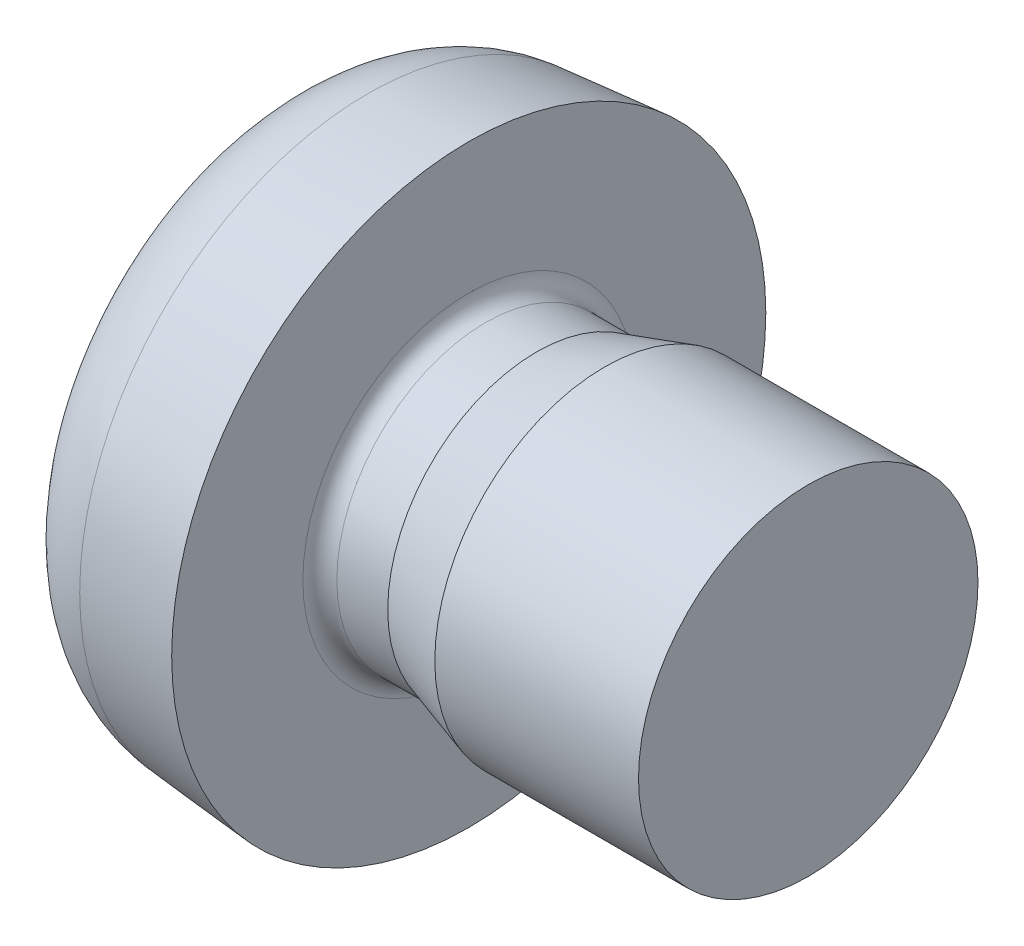
ISO-10303-21;
HEADER;
FILE_DESCRIPTION(('STEP AP214'),'2;1');
FILE_NAME('part.step','',(''),(''),'','','');
FILE_SCHEMA(('AUTOMOTIVE_DESIGN { 1 0 10303 214 1 1 1 1 }'));
ENDSEC;
DATA;
#1=APPLICATION_CONTEXT('core data for automotive mechanical design processes');
#2=APPLICATION_PROTOCOL_DEFINITION('international standard','automotive_design',2000,#1);
#3=PRODUCT_CONTEXT('',#1,'mechanical');
#4=PRODUCT('Part','Part','',(#3));
#5=PRODUCT_RELATED_PRODUCT_CATEGORY('part','',(#4));
#6=PRODUCT_DEFINITION_FORMATION('','',#4);
#7=PRODUCT_DEFINITION_CONTEXT('part definition',#1,'design');
#8=PRODUCT_DEFINITION('design','',#6,#7);
#9=PRODUCT_DEFINITION_SHAPE('','',#8);
#10=(LENGTH_UNIT() NAMED_UNIT(*) SI_UNIT(.MILLI.,.METRE.));
#11=(NAMED_UNIT(*) PLANE_ANGLE_UNIT() SI_UNIT($,.RADIAN.));
#12=(NAMED_UNIT(*) SI_UNIT($,.STERADIAN.) SOLID_ANGLE_UNIT());
#13=UNCERTAINTY_MEASURE_WITH_UNIT(LENGTH_MEASURE(1.E-05),#10,'distance_accuracy_value','');
#14=(GEOMETRIC_REPRESENTATION_CONTEXT(3) GLOBAL_UNCERTAINTY_ASSIGNED_CONTEXT((#13)) GLOBAL_UNIT_ASSIGNED_CONTEXT((#10,
#11,#12)) REPRESENTATION_CONTEXT('',''));
#15=CARTESIAN_POINT('',(0.,0.,0.));
#16=DIRECTION('',(0.,0.,1.));
#17=DIRECTION('',(1.,0.,0.));
#18=AXIS2_PLACEMENT_3D('',#15,#16,#17);
#19=CARTESIAN_POINT('',(3.19999999999697,5.00467722819309E-13,0.));
#20=DIRECTION('',(-1.,0.,0.));
#21=DIRECTION('',(0.,1.,0.));
#22=AXIS2_PLACEMENT_3D('',#19,#20,#21);
#23=SPHERICAL_SURFACE('',#22,4.49999999999697);
#24=CARTESIAN_POINT('',(-1.1171858241993,0.,0.));
#25=DIRECTION('',(-1.,0.,0.));
#26=DIRECTION('',(0.,0.,1.));
#27=AXIS2_PLACEMENT_3D('',#24,#25,#26);
#28=CIRCLE('',#27,1.2696088213827);
#29=CARTESIAN_POINT('',(-1.1171858241993,0.,1.2696088213827));
#30=VERTEX_POINT('',#29);
#31=EDGE_CURVE('E192',#30,#30,#28,.T.);
#32=ORIENTED_EDGE('',*,*,#31,.T.);
#33=EDGE_LOOP('',(#32));
#34=FACE_BOUND('',#33,.T.);
#35=CARTESIAN_POINT('',(3.19999999999697,0.23333333333333,0.));
#36=DIRECTION('',(0.,-1.,0.));
#37=DIRECTION('',(0.,0.,-1.));
#38=AXIS2_PLACEMENT_3D('',#35,#36,#37);
#39=CIRCLE('',#38,4.49394654569105);
#40=CARTESIAN_POINT('',(-1.15724173710329,0.23333333333333,1.1));
#41=VERTEX_POINT('',#40);
#42=CARTESIAN_POINT('',(-1.25592614141861,0.23333333333333,0.58333333333333));
#43=VERTEX_POINT('',#42);
#44=EDGE_CURVE('E11',#41,#43,#39,.T.);
#45=ORIENTED_EDGE('',*,*,#44,.F.);
#46=CARTESIAN_POINT('',(3.19999999999697,5.00467722819309E-13,1.1));
#47=DIRECTION('',(0.,0.,-1.));
#48=DIRECTION('',(-1.,0.,0.));
#49=AXIS2_PLACEMENT_3D('',#46,#47,#48);
#50=CIRCLE('',#49,4.36348484585116);
#51=CARTESIAN_POINT('',(-1.15724173710324,-0.23333333333333,1.1));
#52=VERTEX_POINT('',#51);
#53=EDGE_CURVE('E45',#52,#41,#50,.T.);
#54=ORIENTED_EDGE('',*,*,#53,.F.);
#55=CARTESIAN_POINT('',(3.19999999999697,-0.23333333333333,0.));
#56=DIRECTION('',(0.,1.,0.));
#57=DIRECTION('',(0.,0.,1.));
#58=AXIS2_PLACEMENT_3D('',#55,#56,#57);
#59=CIRCLE('',#58,4.493946545691);
#60=CARTESIAN_POINT('',(-1.25592614141856,-0.23333333333333,0.58333333333333));
#61=VERTEX_POINT('',#60);
#62=EDGE_CURVE('E286',#61,#52,#59,.T.);
#63=ORIENTED_EDGE('',*,*,#62,.F.);
#64=CARTESIAN_POINT('',(-1.25589995149991,-0.58353333333333,0.233333390476192));
#65=CARTESIAN_POINT('',(-1.2584496829755,-0.564084851912746,0.233305072197745));
#66=CARTESIAN_POINT('',(-1.26078445284113,-0.544607407145582,0.234931382302894));
#67=CARTESIAN_POINT('',(-1.26496625073796,-0.506146503499135,0.241398964079554));
#68=CARTESIAN_POINT('',(-1.26681343518266,-0.487162887969295,0.246239202992621));
#69=CARTESIAN_POINT('',(-1.26996529171344,-0.450212688779383,0.259045881137822));
#70=CARTESIAN_POINT('',(-1.27126950205385,-0.432246981919,0.267014970003607));
#71=CARTESIAN_POINT('',(-1.27329407444289,-0.397881531193257,0.285858513724991));
#72=CARTESIAN_POINT('',(-1.27401464252989,-0.381481236508637,0.296731941481725));
#73=CARTESIAN_POINT('',(-1.27484665055323,-0.350862649291144,0.320968649593749));
#74=CARTESIAN_POINT('',(-1.27496356304685,-0.336625892903947,0.334308420734499));
#75=CARTESIAN_POINT('',(-1.27459947008775,-0.310564264718913,0.363163023728163));
#76=CARTESIAN_POINT('',(-1.27411838158194,-0.298739728206596,0.378678157439715));
#77=CARTESIAN_POINT('',(-1.27257602168835,-0.277880461695409,0.411365142703991));
#78=CARTESIAN_POINT('',(-1.27151710548053,-0.268834638240971,0.428530037544093));
#79=CARTESIAN_POINT('',(-1.2688517446949,-0.253710468019218,0.464079307351874));
#80=CARTESIAN_POINT('',(-1.26724547437763,-0.247631178296108,0.48246329270062));
#81=CARTESIAN_POINT('',(-1.26405189501782,-0.239848703553279,0.514692452511942));
#82=CARTESIAN_POINT('',(-1.26258410818833,-0.237398051960483,0.528374369445237));
#83=CARTESIAN_POINT('',(-1.25941320700315,-0.234136171400748,0.555885468612324));
#84=CARTESIAN_POINT('',(-1.2577104299096,-0.233322618458616,0.569714414034388));
#85=CARTESIAN_POINT('',(-1.25589995149995,-0.233333390476192,0.58353333333333));
#86=B_SPLINE_CURVE_WITH_KNOTS('',3,(#64,#65,#66,#67,#68,#69,#70,#71,#72,#73,#74,#75,#76,#77,#78,
#79,#80,#81,#82,#83,#84,#85),.UNSPECIFIED.,.F.,.F.,(4,2,2,2,2,2,2,2,2,2,4),(0.,
0.0587752976278044,0.117531717635116,0.176338002592165,0.235123518594541,0.29337515540582,
0.351634883371351,0.409658903993778,0.467664468805511,0.509501117761438,0.55127833467374),.UNSPECIFIED.);
#87=CARTESIAN_POINT('',(-1.25592614141852,-0.58333333333333,0.23333333333333));
#88=VERTEX_POINT('',#87);
#89=EDGE_CURVE('E279',#88,#61,#86,.T.);
#90=ORIENTED_EDGE('',*,*,#89,.F.);
#91=CARTESIAN_POINT('',(3.19999999999697,5.00467722819309E-13,0.23333333333333));
#92=DIRECTION('',(0.,0.,-1.));
#93=DIRECTION('',(-1.,0.,0.));
#94=AXIS2_PLACEMENT_3D('',#91,#92,#93);
#95=CIRCLE('',#94,4.49394654569103);
#96=CARTESIAN_POINT('',(-1.15724173710314,-1.1,0.23333333333333));
#97=VERTEX_POINT('',#96);
#98=EDGE_CURVE('E287',#97,#88,#95,.T.);
#99=ORIENTED_EDGE('',*,*,#98,.F.);
#100=CARTESIAN_POINT('',(3.19999999999697,-1.1,0.));
#101=DIRECTION('',(0.,1.,0.));
#102=DIRECTION('',(0.,0.,1.));
#103=AXIS2_PLACEMENT_3D('',#100,#101,#102);
#104=CIRCLE('',#103,4.36348484585104);
#105=CARTESIAN_POINT('',(-1.15724173710314,-1.1,-0.23333333333333));
#106=VERTEX_POINT('',#105);
#107=EDGE_CURVE('E346',#106,#97,#104,.T.);
#108=ORIENTED_EDGE('',*,*,#107,.F.);
#109=CARTESIAN_POINT('',(3.19999999999697,5.00467722819309E-13,-0.23333333333333));
#110=DIRECTION('',(0.,0.,1.));
#111=DIRECTION('',(1.,0.,0.));
#112=AXIS2_PLACEMENT_3D('',#109,#110,#111);
#113=CIRCLE('',#112,4.49394654569103);
#114=CARTESIAN_POINT('',(-1.25592614141852,-0.58333333333333,-0.23333333333333));
#115=VERTEX_POINT('',#114);
#116=EDGE_CURVE('E250',#115,#106,#113,.T.);
#117=ORIENTED_EDGE('',*,*,#116,.F.);
#118=CARTESIAN_POINT('',(-1.25589995149995,-0.233333390476192,-0.58353333333333));
#119=CARTESIAN_POINT('',(-1.25844968297554,-0.233305072197745,-0.564084851912747));
#120=CARTESIAN_POINT('',(-1.26078445284116,-0.234931382302894,-0.544607407145583));
#121=CARTESIAN_POINT('',(-1.26496625073799,-0.241398964079553,-0.506146503499136));
#122=CARTESIAN_POINT('',(-1.26681343518268,-0.24623920299262,-0.487162887969297));
#123=CARTESIAN_POINT('',(-1.26996529171346,-0.259045881137821,-0.450212688779386));
#124=CARTESIAN_POINT('',(-1.27126950205387,-0.267014970003605,-0.432246981919004));
#125=CARTESIAN_POINT('',(-1.2732940744429,-0.285858513724989,-0.397881531193261));
#126=CARTESIAN_POINT('',(-1.2740146425299,-0.296731941481722,-0.381481236508641));
#127=CARTESIAN_POINT('',(-1.27484665055324,-0.320968649593745,-0.350862649291149));
#128=CARTESIAN_POINT('',(-1.27496356304685,-0.334308420734494,-0.336625892903952));
#129=CARTESIAN_POINT('',(-1.27459947008774,-0.363163023728157,-0.310564264718918));
#130=CARTESIAN_POINT('',(-1.27411838158193,-0.378678157439708,-0.298739728206601));
#131=CARTESIAN_POINT('',(-1.27257602168833,-0.411365142703983,-0.277880461695414));
#132=CARTESIAN_POINT('',(-1.27151710548051,-0.428530037544085,-0.268834638240975));
#133=CARTESIAN_POINT('',(-1.26885174469488,-0.464079307351865,-0.253710468019221));
#134=CARTESIAN_POINT('',(-1.2672454743776,-0.482463292700611,-0.247631178296111));
#135=CARTESIAN_POINT('',(-1.26405189501779,-0.514692452511934,-0.239848703553281));
#136=CARTESIAN_POINT('',(-1.2625841081883,-0.528374369445231,-0.237398051960483));
#137=CARTESIAN_POINT('',(-1.25941320700312,-0.555885468612321,-0.234136171400748));
#138=CARTESIAN_POINT('',(-1.25771042990956,-0.569714414034387,-0.233322618458616));
#139=CARTESIAN_POINT('',(-1.25589995149991,-0.58353333333333,-0.233333390476192));
#140=B_SPLINE_CURVE_WITH_KNOTS('',3,(#118,#119,#120,#121,#122,#123,#124,#125,#126,#127,#128,
#129,#130,#131,#132,#133,#134,#135,#136,#137,#138,#139),.UNSPECIFIED.,.F.,.F.,(4,2,2,2,2,2,2,2,
2,2,4),(0.,0.0587752976278023,0.117531717635112,0.176338002592159,0.235123518594533,
0.293375155405811,0.35163488337134,0.409658903993767,0.4676644688055,0.509501117761433,
0.55127833467374),.UNSPECIFIED.);
#141=CARTESIAN_POINT('',(-1.25592614141856,-0.23333333333333,-0.58333333333333));
#142=VERTEX_POINT('',#141);
#143=EDGE_CURVE('E243',#142,#115,#140,.T.);
#144=ORIENTED_EDGE('',*,*,#143,.F.);
#145=CARTESIAN_POINT('',(3.19999999999697,-0.23333333333333,0.));
#146=DIRECTION('',(0.,1.,0.));
#147=DIRECTION('',(0.,0.,1.));
#148=AXIS2_PLACEMENT_3D('',#145,#146,#147);
#149=CIRCLE('',#148,4.493946545691);
#150=CARTESIAN_POINT('',(-1.15724173710324,-0.23333333333333,-1.1));
#151=VERTEX_POINT('',#150);
#152=EDGE_CURVE('E241',#151,#142,#149,.T.);
#153=ORIENTED_EDGE('',*,*,#152,.F.);
#154=CARTESIAN_POINT('',(3.19999999999697,5.00467722819309E-13,-1.1));
#155=DIRECTION('',(0.,0.,1.));
#156=DIRECTION('',(1.,0.,0.));
#157=AXIS2_PLACEMENT_3D('',#154,#155,#156);
#158=CIRCLE('',#157,4.36348484585116);
#159=CARTESIAN_POINT('',(-1.15724173710329,0.23333333333333,-1.1));
#160=VERTEX_POINT('',#159);
#161=EDGE_CURVE('E239',#160,#151,#158,.T.);
#162=ORIENTED_EDGE('',*,*,#161,.F.);
#163=CARTESIAN_POINT('',(3.19999999999697,0.23333333333333,0.));
#164=DIRECTION('',(0.,-1.,0.));
#165=DIRECTION('',(0.,0.,-1.));
#166=AXIS2_PLACEMENT_3D('',#163,#164,#165);
#167=CIRCLE('',#166,4.49394654569105);
#168=CARTESIAN_POINT('',(-1.25592614141861,0.23333333333333,-0.58333333333333));
#169=VERTEX_POINT('',#168);
#170=EDGE_CURVE('E236',#169,#160,#167,.T.);
#171=ORIENTED_EDGE('',*,*,#170,.F.);
#172=CARTESIAN_POINT('',(-1.25589995150004,0.58353333333333,-0.233333390476192));
#173=CARTESIAN_POINT('',(-1.25844968297562,0.564084851912746,-0.233305072197745));
#174=CARTESIAN_POINT('',(-1.26078445284125,0.544607407145582,-0.234931382302894));
#175=CARTESIAN_POINT('',(-1.26496625073808,0.506146503499135,-0.241398964079554));
#176=CARTESIAN_POINT('',(-1.26681343518277,0.487162887969296,-0.246239202992621));
#177=CARTESIAN_POINT('',(-1.26996529171354,0.450212688779385,-0.259045881137821));
#178=CARTESIAN_POINT('',(-1.27126950205395,0.432246981919002,-0.267014970003606));
#179=CARTESIAN_POINT('',(-1.27329407444297,0.397881531193259,-0.28585851372499));
#180=CARTESIAN_POINT('',(-1.27401464252997,0.381481236508639,-0.296731941481723));
#181=CARTESIAN_POINT('',(-1.27484665055331,0.350862649291147,-0.320968649593747));
#182=CARTESIAN_POINT('',(-1.27496356304693,0.33662589290395,-0.334308420734496));
#183=CARTESIAN_POINT('',(-1.27459947008782,0.310564264718915,-0.36316302372816));
#184=CARTESIAN_POINT('',(-1.27411838158201,0.298739728206598,-0.378678157439712));
#185=CARTESIAN_POINT('',(-1.27257602168841,0.277880461695411,-0.411365142703988));
#186=CARTESIAN_POINT('',(-1.27151710548059,0.268834638240972,-0.42853003754409));
#187=CARTESIAN_POINT('',(-1.26885174469496,0.253710468019218,-0.464079307351872));
#188=CARTESIAN_POINT('',(-1.26724547437768,0.247631178296108,-0.482463292700618));
#189=CARTESIAN_POINT('',(-1.26405189501787,0.239848703553279,-0.514692452511941));
#190=CARTESIAN_POINT('',(-1.26258410818838,0.237398051960483,-0.528374369445236));
#191=CARTESIAN_POINT('',(-1.2594132070032,0.234136171400748,-0.555885468612324));
#192=CARTESIAN_POINT('',(-1.25771042990965,0.233322618458616,-0.569714414034388));
#193=CARTESIAN_POINT('',(-1.2558999515,0.233333390476192,-0.58353333333333));
#194=B_SPLINE_CURVE_WITH_KNOTS('',3,(#172,#173,#174,#175,#176,#177,#178,#179,#180,#181,#182,
#183,#184,#185,#186,#187,#188,#189,#190,#191,#192,#193),.UNSPECIFIED.,.F.,.F.,(4,2,2,2,2,2,2,2,
2,2,4),(0.,0.0587752976278027,0.117531717635112,0.17633800259216,0.235123518594534,
0.293375155405813,0.351634883371344,0.409658903993772,0.467664468805507,0.509501117761435,
0.551278334673738),.UNSPECIFIED.);
#195=CARTESIAN_POINT('',(-1.25592614141865,0.58333333333333,-0.23333333333333));
#196=VERTEX_POINT('',#195);
#197=EDGE_CURVE('E229',#196,#169,#194,.T.);
#198=ORIENTED_EDGE('',*,*,#197,.F.);
#199=CARTESIAN_POINT('',(3.19999999999697,5.00467722819309E-13,-0.23333333333333));
#200=DIRECTION('',(0.,0.,1.));
#201=DIRECTION('',(1.,0.,0.));
#202=AXIS2_PLACEMENT_3D('',#199,#200,#201);
#203=CIRCLE('',#202,4.49394654569103);
#204=CARTESIAN_POINT('',(-1.15724173710339,1.1,-0.23333333333333));
#205=VERTEX_POINT('',#204);
#206=EDGE_CURVE('E237',#205,#196,#203,.T.);
#207=ORIENTED_EDGE('',*,*,#206,.F.);
#208=CARTESIAN_POINT('',(3.19999999999697,1.1,0.));
#209=DIRECTION('',(0.,-1.,0.));
#210=DIRECTION('',(0.,0.,-1.));
#211=AXIS2_PLACEMENT_3D('',#208,#209,#210);
#212=CIRCLE('',#211,4.36348484585129);
#213=CARTESIAN_POINT('',(-1.15724173710339,1.1,0.23333333333333));
#214=VERTEX_POINT('',#213);
#215=EDGE_CURVE('E379',#214,#205,#212,.T.);
#216=ORIENTED_EDGE('',*,*,#215,.F.);
#217=CARTESIAN_POINT('',(3.19999999999697,5.00467722819309E-13,0.23333333333333));
#218=DIRECTION('',(0.,0.,-1.));
#219=DIRECTION('',(-1.,0.,0.));
#220=AXIS2_PLACEMENT_3D('',#217,#218,#219);
#221=CIRCLE('',#220,4.49394654569103);
#222=CARTESIAN_POINT('',(-1.25592614141865,0.58333333333333,0.23333333333333));
#223=VERTEX_POINT('',#222);
#224=EDGE_CURVE('E202',#223,#214,#221,.T.);
#225=ORIENTED_EDGE('',*,*,#224,.F.);
#226=CARTESIAN_POINT('',(-1.25589995150001,0.233333390476192,0.58353333333333));
#227=CARTESIAN_POINT('',(-1.25844968297559,0.233305072197745,0.564084851912746));
#228=CARTESIAN_POINT('',(-1.26078445284122,0.234931382302894,0.544607407145582));
#229=CARTESIAN_POINT('',(-1.26496625073805,0.241398964079554,0.506146503499134));
#230=CARTESIAN_POINT('',(-1.26681343518274,0.246239202992621,0.487162887969294));
#231=CARTESIAN_POINT('',(-1.26996529171352,0.259045881137823,0.450212688779382));
#232=CARTESIAN_POINT('',(-1.27126950205393,0.267014970003608,0.432246981918999));
#233=CARTESIAN_POINT('',(-1.27329407444296,0.285858513724992,0.397881531193255));
#234=CARTESIAN_POINT('',(-1.27401464252996,0.296731941481726,0.381481236508634));
#235=CARTESIAN_POINT('',(-1.27484665055331,0.320968649593751,0.350862649291142));
#236=CARTESIAN_POINT('',(-1.27496356304693,0.334308420734501,0.336625892903945));
#237=CARTESIAN_POINT('',(-1.27459947008782,0.363163023728167,0.31056426471891));
#238=CARTESIAN_POINT('',(-1.27411838158202,0.378678157439718,0.298739728206593));
#239=CARTESIAN_POINT('',(-1.27257602168843,0.411365142703996,0.277880461695407));
#240=CARTESIAN_POINT('',(-1.2715171054806,0.428530037544098,0.268834638240968));
#241=CARTESIAN_POINT('',(-1.26885174469498,0.464079307351881,0.253710468019215));
#242=CARTESIAN_POINT('',(-1.26724547437771,0.482463292700628,0.247631178296106));
#243=CARTESIAN_POINT('',(-1.2640518950179,0.51469245251195,0.239848703553278));
#244=CARTESIAN_POINT('',(-1.26258410818841,0.528374369445243,0.237398051960482));
#245=CARTESIAN_POINT('',(-1.25941320700324,0.555885468612327,0.234136171400748));
#246=CARTESIAN_POINT('',(-1.25771042990969,0.569714414034389,0.233322618458616));
#247=CARTESIAN_POINT('',(-1.25589995150004,0.58353333333333,0.233333390476192));
#248=B_SPLINE_CURVE_WITH_KNOTS('',3,(#226,#227,#228,#229,#230,#231,#232,#233,#234,#235,#236,
#237,#238,#239,#240,#241,#242,#243,#244,#245,#246,#247),.UNSPECIFIED.,.F.,.F.,(4,2,2,2,2,2,2,2,
2,2,4),(0.,0.0587752976278047,0.117531717635117,0.176338002592166,0.235123518594543,
0.293375155405823,0.351634883371355,0.409658903993783,0.467664468805518,0.50950111776144,
0.551278334673738),.UNSPECIFIED.);
#249=EDGE_CURVE('E195',#43,#223,#248,.T.);
#250=ORIENTED_EDGE('',*,*,#249,.F.);
#251=EDGE_LOOP('',(#45,#54,#63,#90,#99,#108,#117,#144,#153,#162,#171,#198,#207,#216,#225,#250));
#252=FACE_BOUND('',#251,.T.);
#253=ADVANCED_FACE('F37',(#34,#252),#23,.T.);
#254=CARTESIAN_POINT('',(-0.541561047639258,0.,0.));
#255=DIRECTION('',(-1.,0.,0.));
#256=DIRECTION('',(0.,0.,1.));
#257=AXIS2_PLACEMENT_3D('',#254,#255,#256);
#258=TOROIDAL_SURFACE('',#257,1.10032764519819,0.600000000000175);
#259=ORIENTED_EDGE('',*,*,#31,.F.);
#260=EDGE_LOOP('',(#259));
#261=FACE_BOUND('',#260,.T.);
#262=CARTESIAN_POINT('',(-0.59385449328798,0.,0.));
#263=DIRECTION('',(-1.,0.,0.));
#264=DIRECTION('',(0.,0.,1.));
#265=AXIS2_PLACEMENT_3D('',#262,#263,#264);
#266=CIRCLE('',#265,1.6980444640534);
#267=CARTESIAN_POINT('',(-0.59385449328798,0.,1.6980444640534));
#268=VERTEX_POINT('',#267);
#269=EDGE_CURVE('E189',#268,#268,#266,.T.);
#270=ORIENTED_EDGE('',*,*,#269,.T.);
#271=EDGE_LOOP('',(#270));
#272=FACE_BOUND('',#271,.T.);
#273=ADVANCED_FACE('F403',(#261,#272),#258,.T.);
#274=CARTESIAN_POINT('',(0.,0.,0.));
#275=DIRECTION('',(1.,0.,0.));
#276=DIRECTION('',(0.,0.,-1.));
#277=AXIS2_PLACEMENT_3D('',#274,#275,#276);
#278=CONICAL_SURFACE('',#277,1.75,0.0872664625996661);
#279=ORIENTED_EDGE('',*,*,#269,.F.);
#280=EDGE_LOOP('',(#279));
#281=FACE_BOUND('',#280,.T.);
#282=CARTESIAN_POINT('',(0.,0.,0.));
#283=DIRECTION('',(-1.,0.,0.));
#284=DIRECTION('',(0.,0.,1.));
#285=AXIS2_PLACEMENT_3D('',#282,#283,#284);
#286=CIRCLE('',#285,1.75);
#287=CARTESIAN_POINT('',(0.,0.,1.75));
#288=VERTEX_POINT('',#287);
#289=EDGE_CURVE('E186',#288,#288,#286,.T.);
#290=ORIENTED_EDGE('',*,*,#289,.T.);
#291=EDGE_LOOP('',(#290));
#292=FACE_BOUND('',#291,.T.);
#293=ADVANCED_FACE('F408',(#281,#292),#278,.T.);
#294=CARTESIAN_POINT('',(0.,1.75,0.));
#295=DIRECTION('',(-1.,0.,0.));
#296=DIRECTION('',(0.,0.,1.));
#297=AXIS2_PLACEMENT_3D('',#294,#295,#296);
#298=PLANE('',#297);
#299=ORIENTED_EDGE('',*,*,#289,.F.);
#300=EDGE_LOOP('',(#299));
#301=FACE_BOUND('',#300,.T.);
#302=CARTESIAN_POINT('',(0.,0.,0.));
#303=DIRECTION('',(-1.,0.,0.));
#304=DIRECTION('',(0.,0.,1.));
#305=AXIS2_PLACEMENT_3D('',#302,#303,#304);
#306=CIRCLE('',#305,0.97725000000002);
#307=CARTESIAN_POINT('',(0.,0.,0.97725000000002));
#308=VERTEX_POINT('',#307);
#309=EDGE_CURVE('E183',#308,#308,#306,.T.);
#310=ORIENTED_EDGE('',*,*,#309,.T.);
#311=EDGE_LOOP('',(#310));
#312=FACE_BOUND('',#311,.T.);
#313=ADVANCED_FACE('F416',(#301,#312),#298,.F.);
#314=CARTESIAN_POINT('',(0.0999999999999906,0.,0.));
#315=DIRECTION('',(-1.,0.,0.));
#316=DIRECTION('',(0.,0.,1.));
#317=AXIS2_PLACEMENT_3D('',#314,#315,#316);
#318=TOROIDAL_SURFACE('',#317,0.977250000000011,0.0999999999999906);
#319=ORIENTED_EDGE('',*,*,#309,.F.);
#320=EDGE_LOOP('',(#319));
#321=FACE_BOUND('',#320,.T.);
#322=CARTESIAN_POINT('',(0.0999999999999981,0.,0.));
#323=DIRECTION('',(-1.,0.,0.));
#324=DIRECTION('',(0.,0.,1.));
#325=AXIS2_PLACEMENT_3D('',#322,#323,#324);
#326=CIRCLE('',#325,0.87725000000002);
#327=CARTESIAN_POINT('',(0.0999999999999981,0.,0.87725000000002));
#328=VERTEX_POINT('',#327);
#329=EDGE_CURVE('E180',#328,#328,#326,.T.);
#330=ORIENTED_EDGE('',*,*,#329,.T.);
#331=EDGE_LOOP('',(#330));
#332=FACE_BOUND('',#331,.T.);
#333=ADVANCED_FACE('F422',(#321,#332),#318,.F.);
#334=CARTESIAN_POINT('',(2.,0.,0.));
#335=DIRECTION('',(-1.,0.,0.));
#336=DIRECTION('',(0.,0.,1.));
#337=AXIS2_PLACEMENT_3D('',#334,#335,#336);
#338=CYLINDRICAL_SURFACE('',#337,0.877250000000015);
#339=ORIENTED_EDGE('',*,*,#329,.F.);
#340=EDGE_LOOP('',(#339));
#341=FACE_BOUND('',#340,.T.);
#342=CARTESIAN_POINT('',(0.40000000000002,0.,0.));
#343=DIRECTION('',(-1.,0.,0.));
#344=DIRECTION('',(0.,0.,1.));
#345=AXIS2_PLACEMENT_3D('',#342,#343,#344);
#346=CIRCLE('',#345,0.87725000000001);
#347=CARTESIAN_POINT('',(0.40000000000002,0.,0.87725000000001));
#348=VERTEX_POINT('',#347);
#349=EDGE_CURVE('E177',#348,#348,#346,.T.);
#350=ORIENTED_EDGE('',*,*,#349,.T.);
#351=EDGE_LOOP('',(#350));
#352=FACE_BOUND('',#351,.T.);
#353=ADVANCED_FACE('F428',(#341,#352),#338,.T.);
#354=CARTESIAN_POINT('',(0.8,0.,0.));
#355=DIRECTION('',(1.,0.,0.));
#356=DIRECTION('',(0.,0.,-1.));
#357=AXIS2_PLACEMENT_3D('',#354,#355,#356);
#358=CONICAL_SURFACE('',#357,1.,0.297752138542782);
#359=ORIENTED_EDGE('',*,*,#349,.F.);
#360=EDGE_LOOP('',(#359));
#361=FACE_BOUND('',#360,.T.);
#362=CARTESIAN_POINT('',(0.8,0.,0.));
#363=DIRECTION('',(-1.,0.,0.));
#364=DIRECTION('',(0.,0.,1.));
#365=AXIS2_PLACEMENT_3D('',#362,#363,#364);
#366=CIRCLE('',#365,1.);
#367=CARTESIAN_POINT('',(0.8,0.,1.));
#368=VERTEX_POINT('',#367);
#369=EDGE_CURVE('E169',#368,#368,#366,.T.);
#370=ORIENTED_EDGE('',*,*,#369,.T.);
#371=EDGE_LOOP('',(#370));
#372=FACE_BOUND('',#371,.T.);
#373=ADVANCED_FACE('F434',(#361,#372),#358,.T.);
#374=CARTESIAN_POINT('',(2.,0.,0.));
#375=DIRECTION('',(-1.,0.,0.));
#376=DIRECTION('',(0.,0.,1.));
#377=AXIS2_PLACEMENT_3D('',#374,#375,#376);
#378=CYLINDRICAL_SURFACE('',#377,1.);
#379=ORIENTED_EDGE('',*,*,#369,.F.);
#380=EDGE_LOOP('',(#379));
#381=FACE_BOUND('',#380,.T.);
#382=CARTESIAN_POINT('',(2.,0.,0.));
#383=DIRECTION('',(-1.,0.,0.));
#384=DIRECTION('',(0.,0.,1.));
#385=AXIS2_PLACEMENT_3D('',#382,#383,#384);
#386=CIRCLE('',#385,1.);
#387=CARTESIAN_POINT('',(2.,0.,1.));
#388=VERTEX_POINT('',#387);
#389=EDGE_CURVE('E165',#388,#388,#386,.T.);
#390=ORIENTED_EDGE('',*,*,#389,.T.);
#391=EDGE_LOOP('',(#390));
#392=FACE_BOUND('',#391,.T.);
#393=ADVANCED_FACE('F440',(#381,#392),#378,.T.);
#394=CARTESIAN_POINT('',(2.,1.,0.));
#395=DIRECTION('',(-1.,0.,0.));
#396=DIRECTION('',(0.,0.,1.));
#397=AXIS2_PLACEMENT_3D('',#394,#395,#396);
#398=PLANE('',#397);
#399=ORIENTED_EDGE('',*,*,#389,.F.);
#400=EDGE_LOOP('',(#399));
#401=FACE_BOUND('',#400,.T.);
#402=ADVANCED_FACE('F446',(#401),#398,.F.);
#403=CARTESIAN_POINT('',(-0.65,0.23333333333333,0.58333333333333));
#404=DIRECTION('',(0.,-1.,0.));
#405=DIRECTION('',(0.,0.,-1.));
#406=AXIS2_PLACEMENT_3D('',#403,#404,#405);
#407=PLANE('',#406);
#408=ORIENTED_EDGE('',*,*,#44,.T.);
#409=DIRECTION('',(-1.,0.,0.));
#410=VECTOR('',#409,1.);
#411=CARTESIAN_POINT('',(-0.65,0.23333333333333,0.58333333333333));
#412=LINE('',#411,#410);
#413=CARTESIAN_POINT('',(-0.65,0.23333333333333,0.58333333333333));
#414=VERTEX_POINT('',#413);
#415=EDGE_CURVE('E52',#414,#43,#412,.T.);
#416=ORIENTED_EDGE('',*,*,#415,.F.);
#417=DIRECTION('',(0.,0.,1.));
#418=VECTOR('',#417,1.);
#419=CARTESIAN_POINT('',(-0.65,0.23333333333333,0.58333333333333));
#420=LINE('',#419,#418);
#421=CARTESIAN_POINT('',(-0.65,0.23333333333333,1.1));
#422=VERTEX_POINT('',#421);
#423=EDGE_CURVE('E154',#414,#422,#420,.T.);
#424=ORIENTED_EDGE('',*,*,#423,.T.);
#425=DIRECTION('',(-1.,0.,0.));
#426=VECTOR('',#425,1.);
#427=CARTESIAN_POINT('',(-0.65,0.23333333333333,1.1));
#428=LINE('',#427,#426);
#429=EDGE_CURVE('E161',#422,#41,#428,.T.);
#430=ORIENTED_EDGE('',*,*,#429,.T.);
#431=EDGE_LOOP('',(#408,#416,#424,#430));
#432=FACE_BOUND('',#431,.T.);
#433=ADVANCED_FACE('F160',(#432),#407,.T.);
#434=CARTESIAN_POINT('',(-0.65,0.23333333333333,1.1));
#435=DIRECTION('',(0.,0.,-1.));
#436=DIRECTION('',(-1.,0.,0.));
#437=AXIS2_PLACEMENT_3D('',#434,#435,#436);
#438=PLANE('',#437);
#439=ORIENTED_EDGE('',*,*,#53,.T.);
#440=ORIENTED_EDGE('',*,*,#429,.F.);
#441=DIRECTION('',(0.,-1.,0.));
#442=VECTOR('',#441,1.);
#443=CARTESIAN_POINT('',(-0.65,0.23333333333333,1.1));
#444=LINE('',#443,#442);
#445=CARTESIAN_POINT('',(-0.65,-0.23333333333333,1.1));
#446=VERTEX_POINT('',#445);
#447=EDGE_CURVE('E150',#422,#446,#444,.T.);
#448=ORIENTED_EDGE('',*,*,#447,.T.);
#449=DIRECTION('',(-1.,0.,0.));
#450=VECTOR('',#449,1.);
#451=CARTESIAN_POINT('',(-0.65,-0.23333333333333,1.1));
#452=LINE('',#451,#450);
#453=EDGE_CURVE('E166',#446,#52,#452,.T.);
#454=ORIENTED_EDGE('',*,*,#453,.T.);
#455=EDGE_LOOP('',(#439,#440,#448,#454));
#456=FACE_BOUND('',#455,.T.);
#457=ADVANCED_FACE('F164',(#456),#438,.T.);
#458=CARTESIAN_POINT('',(-0.65,-0.23333333333333,1.1));
#459=DIRECTION('',(0.,1.,0.));
#460=DIRECTION('',(0.,0.,1.));
#461=AXIS2_PLACEMENT_3D('',#458,#459,#460);
#462=PLANE('',#461);
#463=ORIENTED_EDGE('',*,*,#62,.T.);
#464=ORIENTED_EDGE('',*,*,#453,.F.);
#465=DIRECTION('',(0.,0.,-1.));
#466=VECTOR('',#465,1.);
#467=CARTESIAN_POINT('',(-0.65,-0.23333333333333,1.1));
#468=LINE('',#467,#466);
#469=CARTESIAN_POINT('',(-0.65,-0.23333333333333,0.58333333333333));
#470=VERTEX_POINT('',#469);
#471=EDGE_CURVE('E156',#446,#470,#468,.T.);
#472=ORIENTED_EDGE('',*,*,#471,.T.);
#473=DIRECTION('',(-1.,0.,0.));
#474=VECTOR('',#473,1.);
#475=CARTESIAN_POINT('',(-0.65,-0.23333333333333,0.58333333333333));
#476=LINE('',#475,#474);
#477=EDGE_CURVE('E171',#470,#61,#476,.T.);
#478=ORIENTED_EDGE('',*,*,#477,.T.);
#479=EDGE_LOOP('',(#463,#464,#472,#478));
#480=FACE_BOUND('',#479,.T.);
#481=ADVANCED_FACE('F275',(#480),#462,.T.);
#482=CARTESIAN_POINT('',(-0.65,-0.583333333333336,0.583333333333336));
#483=DIRECTION('',(-1.,0.,0.));
#484=DIRECTION('',(0.,0.,1.));
#485=AXIS2_PLACEMENT_3D('',#482,#483,#484);
#486=CYLINDRICAL_SURFACE('',#485,0.350000000000006);
#487=ORIENTED_EDGE('',*,*,#89,.T.);
#488=ORIENTED_EDGE('',*,*,#477,.F.);
#489=CARTESIAN_POINT('',(-0.65,-0.583333333333336,0.583333333333336));
#490=DIRECTION('',(-1.,0.,0.));
#491=DIRECTION('',(0.,0.,1.));
#492=AXIS2_PLACEMENT_3D('',#489,#490,#491);
#493=CIRCLE('',#492,0.350000000000006);
#494=CARTESIAN_POINT('',(-0.65,-0.58333333333333,0.23333333333333));
#495=VERTEX_POINT('',#494);
#496=EDGE_CURVE('E341',#470,#495,#493,.T.);
#497=ORIENTED_EDGE('',*,*,#496,.T.);
#498=DIRECTION('',(-1.,0.,0.));
#499=VECTOR('',#498,1.);
#500=CARTESIAN_POINT('',(-0.65,-0.58333333333333,0.23333333333333));
#501=LINE('',#500,#499);
#502=EDGE_CURVE('E338',#495,#88,#501,.T.);
#503=ORIENTED_EDGE('',*,*,#502,.T.);
#504=EDGE_LOOP('',(#487,#488,#497,#503));
#505=FACE_BOUND('',#504,.T.);
#506=ADVANCED_FACE('F270',(#505),#486,.T.);
#507=CARTESIAN_POINT('',(-0.65,-0.58333333333333,0.23333333333333));
#508=DIRECTION('',(0.,0.,-1.));
#509=DIRECTION('',(-1.,0.,0.));
#510=AXIS2_PLACEMENT_3D('',#507,#508,#509);
#511=PLANE('',#510);
#512=ORIENTED_EDGE('',*,*,#98,.T.);
#513=ORIENTED_EDGE('',*,*,#502,.F.);
#514=DIRECTION('',(0.,-1.,0.));
#515=VECTOR('',#514,1.);
#516=CARTESIAN_POINT('',(-0.65,-0.58333333333333,0.23333333333333));
#517=LINE('',#516,#515);
#518=CARTESIAN_POINT('',(-0.65,-1.1,0.23333333333333));
#519=VERTEX_POINT('',#518);
#520=EDGE_CURVE('E355',#495,#519,#517,.T.);
#521=ORIENTED_EDGE('',*,*,#520,.T.);
#522=DIRECTION('',(-1.,0.,0.));
#523=VECTOR('',#522,1.);
#524=CARTESIAN_POINT('',(-0.65,-1.1,0.23333333333333));
#525=LINE('',#524,#523);
#526=EDGE_CURVE('E335',#519,#97,#525,.T.);
#527=ORIENTED_EDGE('',*,*,#526,.T.);
#528=EDGE_LOOP('',(#512,#513,#521,#527));
#529=FACE_BOUND('',#528,.T.);
#530=ADVANCED_FACE('F266',(#529),#511,.T.);
#531=CARTESIAN_POINT('',(-0.65,-1.1,0.23333333333333));
#532=DIRECTION('',(0.,1.,0.));
#533=DIRECTION('',(0.,0.,1.));
#534=AXIS2_PLACEMENT_3D('',#531,#532,#533);
#535=PLANE('',#534);
#536=ORIENTED_EDGE('',*,*,#107,.T.);
#537=ORIENTED_EDGE('',*,*,#526,.F.);
#538=DIRECTION('',(0.,0.,-1.));
#539=VECTOR('',#538,1.);
#540=CARTESIAN_POINT('',(-0.65,-1.1,0.23333333333333));
#541=LINE('',#540,#539);
#542=CARTESIAN_POINT('',(-0.65,-1.1,-0.23333333333333));
#543=VERTEX_POINT('',#542);
#544=EDGE_CURVE('E353',#519,#543,#541,.T.);
#545=ORIENTED_EDGE('',*,*,#544,.T.);
#546=DIRECTION('',(-1.,0.,0.));
#547=VECTOR('',#546,1.);
#548=CARTESIAN_POINT('',(-0.65,-1.1,-0.23333333333333));
#549=LINE('',#548,#547);
#550=EDGE_CURVE('E332',#543,#106,#549,.T.);
#551=ORIENTED_EDGE('',*,*,#550,.T.);
#552=EDGE_LOOP('',(#536,#537,#545,#551));
#553=FACE_BOUND('',#552,.T.);
#554=ADVANCED_FACE('F262',(#553),#535,.T.);
#555=CARTESIAN_POINT('',(-0.65,-1.1,-0.23333333333333));
#556=DIRECTION('',(0.,0.,1.));
#557=DIRECTION('',(1.,0.,0.));
#558=AXIS2_PLACEMENT_3D('',#555,#556,#557);
#559=PLANE('',#558);
#560=ORIENTED_EDGE('',*,*,#116,.T.);
#561=ORIENTED_EDGE('',*,*,#550,.F.);
#562=DIRECTION('',(0.,1.,0.));
#563=VECTOR('',#562,1.);
#564=CARTESIAN_POINT('',(-0.65,-1.1,-0.23333333333333));
#565=LINE('',#564,#563);
#566=CARTESIAN_POINT('',(-0.65,-0.58333333333333,-0.23333333333333));
#567=VERTEX_POINT('',#566);
#568=EDGE_CURVE('E354',#543,#567,#565,.T.);
#569=ORIENTED_EDGE('',*,*,#568,.T.);
#570=DIRECTION('',(-1.,0.,0.));
#571=VECTOR('',#570,1.);
#572=CARTESIAN_POINT('',(-0.65,-0.58333333333333,-0.23333333333333));
#573=LINE('',#572,#571);
#574=EDGE_CURVE('E329',#567,#115,#573,.T.);
#575=ORIENTED_EDGE('',*,*,#574,.T.);
#576=EDGE_LOOP('',(#560,#561,#569,#575));
#577=FACE_BOUND('',#576,.T.);
#578=ADVANCED_FACE('F258',(#577),#559,.T.);
#579=CARTESIAN_POINT('',(-0.65,-0.583333333333336,-0.583333333333336));
#580=DIRECTION('',(-1.,0.,0.));
#581=DIRECTION('',(0.,0.,1.));
#582=AXIS2_PLACEMENT_3D('',#579,#580,#581);
#583=CYLINDRICAL_SURFACE('',#582,0.350000000000006);
#584=ORIENTED_EDGE('',*,*,#143,.T.);
#585=ORIENTED_EDGE('',*,*,#574,.F.);
#586=CARTESIAN_POINT('',(-0.65,-0.583333333333336,-0.583333333333336));
#587=DIRECTION('',(-1.,0.,0.));
#588=DIRECTION('',(0.,0.,1.));
#589=AXIS2_PLACEMENT_3D('',#586,#587,#588);
#590=CIRCLE('',#589,0.350000000000006);
#591=CARTESIAN_POINT('',(-0.65,-0.23333333333333,-0.58333333333333));
#592=VERTEX_POINT('',#591);
#593=EDGE_CURVE('E357',#567,#592,#590,.T.);
#594=ORIENTED_EDGE('',*,*,#593,.T.);
#595=DIRECTION('',(-1.,0.,0.));
#596=VECTOR('',#595,1.);
#597=CARTESIAN_POINT('',(-0.65,-0.23333333333333,-0.58333333333333));
#598=LINE('',#597,#596);
#599=EDGE_CURVE('E326',#592,#142,#598,.T.);
#600=ORIENTED_EDGE('',*,*,#599,.T.);
#601=EDGE_LOOP('',(#584,#585,#594,#600));
#602=FACE_BOUND('',#601,.T.);
#603=ADVANCED_FACE('F252',(#602),#583,.T.);
#604=CARTESIAN_POINT('',(-0.65,-0.23333333333333,-0.58333333333333));
#605=DIRECTION('',(0.,1.,0.));
#606=DIRECTION('',(0.,0.,1.));
#607=AXIS2_PLACEMENT_3D('',#604,#605,#606);
#608=PLANE('',#607);
#609=ORIENTED_EDGE('',*,*,#152,.T.);
#610=ORIENTED_EDGE('',*,*,#599,.F.);
#611=DIRECTION('',(0.,0.,-1.));
#612=VECTOR('',#611,1.);
#613=CARTESIAN_POINT('',(-0.65,-0.23333333333333,-0.58333333333333));
#614=LINE('',#613,#612);
#615=CARTESIAN_POINT('',(-0.65,-0.23333333333333,-1.1));
#616=VERTEX_POINT('',#615);
#617=EDGE_CURVE('E363',#592,#616,#614,.T.);
#618=ORIENTED_EDGE('',*,*,#617,.T.);
#619=DIRECTION('',(-1.,0.,0.));
#620=VECTOR('',#619,1.);
#621=CARTESIAN_POINT('',(-0.65,-0.23333333333333,-1.1));
#622=LINE('',#621,#620);
#623=EDGE_CURVE('E323',#616,#151,#622,.T.);
#624=ORIENTED_EDGE('',*,*,#623,.T.);
#625=EDGE_LOOP('',(#609,#610,#618,#624));
#626=FACE_BOUND('',#625,.T.);
#627=ADVANCED_FACE('F257',(#626),#608,.T.);
#628=CARTESIAN_POINT('',(-0.65,-0.23333333333333,-1.1));
#629=DIRECTION('',(0.,0.,1.));
#630=DIRECTION('',(1.,0.,0.));
#631=AXIS2_PLACEMENT_3D('',#628,#629,#630);
#632=PLANE('',#631);
#633=ORIENTED_EDGE('',*,*,#161,.T.);
#634=ORIENTED_EDGE('',*,*,#623,.F.);
#635=DIRECTION('',(0.,1.,0.));
#636=VECTOR('',#635,1.);
#637=CARTESIAN_POINT('',(-0.65,-0.23333333333333,-1.1));
#638=LINE('',#637,#636);
#639=CARTESIAN_POINT('',(-0.65,0.23333333333333,-1.1));
#640=VERTEX_POINT('',#639);
#641=EDGE_CURVE('E365',#616,#640,#638,.T.);
#642=ORIENTED_EDGE('',*,*,#641,.T.);
#643=DIRECTION('',(-1.,0.,0.));
#644=VECTOR('',#643,1.);
#645=CARTESIAN_POINT('',(-0.65,0.23333333333333,-1.1));
#646=LINE('',#645,#644);
#647=EDGE_CURVE('E320',#640,#160,#646,.T.);
#648=ORIENTED_EDGE('',*,*,#647,.T.);
#649=EDGE_LOOP('',(#633,#634,#642,#648));
#650=FACE_BOUND('',#649,.T.);
#651=ADVANCED_FACE('F394',(#650),#632,.T.);
#652=CARTESIAN_POINT('',(-0.65,0.23333333333333,-1.1));
#653=DIRECTION('',(0.,-1.,0.));
#654=DIRECTION('',(0.,0.,-1.));
#655=AXIS2_PLACEMENT_3D('',#652,#653,#654);
#656=PLANE('',#655);
#657=ORIENTED_EDGE('',*,*,#170,.T.);
#658=ORIENTED_EDGE('',*,*,#647,.F.);
#659=DIRECTION('',(0.,0.,1.));
#660=VECTOR('',#659,1.);
#661=CARTESIAN_POINT('',(-0.65,0.23333333333333,-1.1));
#662=LINE('',#661,#660);
#663=CARTESIAN_POINT('',(-0.65,0.23333333333333,-0.58333333333333));
#664=VERTEX_POINT('',#663);
#665=EDGE_CURVE('E367',#640,#664,#662,.T.);
#666=ORIENTED_EDGE('',*,*,#665,.T.);
#667=DIRECTION('',(-1.,0.,0.));
#668=VECTOR('',#667,1.);
#669=CARTESIAN_POINT('',(-0.65,0.23333333333333,-0.58333333333333));
#670=LINE('',#669,#668);
#671=EDGE_CURVE('E317',#664,#169,#670,.T.);
#672=ORIENTED_EDGE('',*,*,#671,.T.);
#673=EDGE_LOOP('',(#657,#658,#666,#672));
#674=FACE_BOUND('',#673,.T.);
#675=ADVANCED_FACE('F225',(#674),#656,.T.);
#676=CARTESIAN_POINT('',(-0.65,0.583333333333336,-0.583333333333336));
#677=DIRECTION('',(-1.,0.,0.));
#678=DIRECTION('',(0.,0.,1.));
#679=AXIS2_PLACEMENT_3D('',#676,#677,#678);
#680=CYLINDRICAL_SURFACE('',#679,0.350000000000006);
#681=ORIENTED_EDGE('',*,*,#197,.T.);
#682=ORIENTED_EDGE('',*,*,#671,.F.);
#683=CARTESIAN_POINT('',(-0.65,0.583333333333336,-0.583333333333336));
#684=DIRECTION('',(-1.,0.,0.));
#685=DIRECTION('',(0.,0.,1.));
#686=AXIS2_PLACEMENT_3D('',#683,#684,#685);
#687=CIRCLE('',#686,0.350000000000006);
#688=CARTESIAN_POINT('',(-0.65,0.58333333333333,-0.23333333333333));
#689=VERTEX_POINT('',#688);
#690=EDGE_CURVE('E369',#664,#689,#687,.T.);
#691=ORIENTED_EDGE('',*,*,#690,.T.);
#692=DIRECTION('',(-1.,0.,0.));
#693=VECTOR('',#692,1.);
#694=CARTESIAN_POINT('',(-0.65,0.58333333333333,-0.23333333333333));
#695=LINE('',#694,#693);
#696=EDGE_CURVE('E314',#689,#196,#695,.T.);
#697=ORIENTED_EDGE('',*,*,#696,.T.);
#698=EDGE_LOOP('',(#681,#682,#691,#697));
#699=FACE_BOUND('',#698,.T.);
#700=ADVANCED_FACE('F220',(#699),#680,.T.);
#701=CARTESIAN_POINT('',(-0.65,0.58333333333333,-0.23333333333333));
#702=DIRECTION('',(0.,0.,1.));
#703=DIRECTION('',(1.,0.,0.));
#704=AXIS2_PLACEMENT_3D('',#701,#702,#703);
#705=PLANE('',#704);
#706=ORIENTED_EDGE('',*,*,#206,.T.);
#707=ORIENTED_EDGE('',*,*,#696,.F.);
#708=DIRECTION('',(0.,1.,0.));
#709=VECTOR('',#708,1.);
#710=CARTESIAN_POINT('',(-0.65,0.58333333333333,-0.23333333333333));
#711=LINE('',#710,#709);
#712=CARTESIAN_POINT('',(-0.65,1.1,-0.23333333333333));
#713=VERTEX_POINT('',#712);
#714=EDGE_CURVE('E371',#689,#713,#711,.T.);
#715=ORIENTED_EDGE('',*,*,#714,.T.);
#716=DIRECTION('',(-1.,0.,0.));
#717=VECTOR('',#716,1.);
#718=CARTESIAN_POINT('',(-0.65,1.1,-0.23333333333333));
#719=LINE('',#718,#717);
#720=EDGE_CURVE('E306',#713,#205,#719,.T.);
#721=ORIENTED_EDGE('',*,*,#720,.T.);
#722=EDGE_LOOP('',(#706,#707,#715,#721));
#723=FACE_BOUND('',#722,.T.);
#724=ADVANCED_FACE('F216',(#723),#705,.T.);
#725=CARTESIAN_POINT('',(-0.65,1.1,-0.23333333333333));
#726=DIRECTION('',(0.,-1.,0.));
#727=DIRECTION('',(0.,0.,-1.));
#728=AXIS2_PLACEMENT_3D('',#725,#726,#727);
#729=PLANE('',#728);
#730=ORIENTED_EDGE('',*,*,#215,.T.);
#731=ORIENTED_EDGE('',*,*,#720,.F.);
#732=DIRECTION('',(0.,0.,1.));
#733=VECTOR('',#732,1.);
#734=CARTESIAN_POINT('',(-0.65,1.1,-0.23333333333333));
#735=LINE('',#734,#733);
#736=CARTESIAN_POINT('',(-0.65,1.1,0.23333333333333));
#737=VERTEX_POINT('',#736);
#738=EDGE_CURVE('E373',#713,#737,#735,.T.);
#739=ORIENTED_EDGE('',*,*,#738,.T.);
#740=DIRECTION('',(-1.,0.,0.));
#741=VECTOR('',#740,1.);
#742=CARTESIAN_POINT('',(-0.65,1.1,0.23333333333333));
#743=LINE('',#742,#741);
#744=EDGE_CURVE('E304',#737,#214,#743,.T.);
#745=ORIENTED_EDGE('',*,*,#744,.T.);
#746=EDGE_LOOP('',(#730,#731,#739,#745));
#747=FACE_BOUND('',#746,.T.);
#748=ADVANCED_FACE('F212',(#747),#729,.T.);
#749=CARTESIAN_POINT('',(-0.65,1.1,0.23333333333333));
#750=DIRECTION('',(0.,0.,-1.));
#751=DIRECTION('',(-1.,0.,0.));
#752=AXIS2_PLACEMENT_3D('',#749,#750,#751);
#753=PLANE('',#752);
#754=ORIENTED_EDGE('',*,*,#224,.T.);
#755=ORIENTED_EDGE('',*,*,#744,.F.);
#756=DIRECTION('',(0.,-1.,0.));
#757=VECTOR('',#756,1.);
#758=CARTESIAN_POINT('',(-0.65,1.1,0.23333333333333));
#759=LINE('',#758,#757);
#760=CARTESIAN_POINT('',(-0.65,0.58333333333333,0.23333333333333));
#761=VERTEX_POINT('',#760);
#762=EDGE_CURVE('E303',#737,#761,#759,.T.);
#763=ORIENTED_EDGE('',*,*,#762,.T.);
#764=DIRECTION('',(-1.,0.,0.));
#765=VECTOR('',#764,1.);
#766=CARTESIAN_POINT('',(-0.65,0.58333333333333,0.23333333333333));
#767=LINE('',#766,#765);
#768=EDGE_CURVE('E299',#761,#223,#767,.T.);
#769=ORIENTED_EDGE('',*,*,#768,.T.);
#770=EDGE_LOOP('',(#754,#755,#763,#769));
#771=FACE_BOUND('',#770,.T.);
#772=ADVANCED_FACE('F209',(#771),#753,.T.);
#773=CARTESIAN_POINT('',(-0.65,0.583333333333336,0.583333333333336));
#774=DIRECTION('',(-1.,0.,0.));
#775=DIRECTION('',(0.,0.,1.));
#776=AXIS2_PLACEMENT_3D('',#773,#774,#775);
#777=CYLINDRICAL_SURFACE('',#776,0.350000000000006);
#778=ORIENTED_EDGE('',*,*,#249,.T.);
#779=ORIENTED_EDGE('',*,*,#768,.F.);
#780=CARTESIAN_POINT('',(-0.65,0.583333333333336,0.583333333333336));
#781=DIRECTION('',(-1.,0.,0.));
#782=DIRECTION('',(0.,0.,1.));
#783=AXIS2_PLACEMENT_3D('',#780,#781,#782);
#784=CIRCLE('',#783,0.350000000000006);
#785=EDGE_CURVE('E308',#761,#414,#784,.T.);
#786=ORIENTED_EDGE('',*,*,#785,.T.);
#787=ORIENTED_EDGE('',*,*,#415,.T.);
#788=EDGE_LOOP('',(#778,#779,#786,#787));
#789=FACE_BOUND('',#788,.T.);
#790=ADVANCED_FACE('F204',(#789),#777,.T.);
#791=CARTESIAN_POINT('',(-0.65,-0.583333333333336,0.583333333333336));
#792=DIRECTION('',(-1.,0.,0.));
#793=DIRECTION('',(0.,0.,1.));
#794=AXIS2_PLACEMENT_3D('',#791,#792,#793);
#795=PLANE('',#794);
#796=ORIENTED_EDGE('',*,*,#423,.F.);
#797=ORIENTED_EDGE('',*,*,#785,.F.);
#798=ORIENTED_EDGE('',*,*,#762,.F.);
#799=ORIENTED_EDGE('',*,*,#738,.F.);
#800=ORIENTED_EDGE('',*,*,#714,.F.);
#801=ORIENTED_EDGE('',*,*,#690,.F.);
#802=ORIENTED_EDGE('',*,*,#665,.F.);
#803=ORIENTED_EDGE('',*,*,#641,.F.);
#804=ORIENTED_EDGE('',*,*,#617,.F.);
#805=ORIENTED_EDGE('',*,*,#593,.F.);
#806=ORIENTED_EDGE('',*,*,#568,.F.);
#807=ORIENTED_EDGE('',*,*,#544,.F.);
#808=ORIENTED_EDGE('',*,*,#520,.F.);
#809=ORIENTED_EDGE('',*,*,#496,.F.);
#810=ORIENTED_EDGE('',*,*,#471,.F.);
#811=ORIENTED_EDGE('',*,*,#447,.F.);
#812=EDGE_LOOP('',(#796,#797,#798,#799,#800,#801,#802,#803,#804,#805,#806,#807,#808,#809,#810,#811));
#813=FACE_BOUND('',#812,.T.);
#814=ADVANCED_FACE('F152',(#813),#795,.T.);
#815=CLOSED_SHELL('',(#253,#273,#293,#313,#333,#353,#373,#393,#402,#433,#457,#481,#506,#530,
#554,#578,#603,#627,#651,#675,#700,#724,#748,#772,#790,#814));
#816=MANIFOLD_SOLID_BREP('B2',#815);
#817=ADVANCED_BREP_SHAPE_REPRESENTATION('',(#18,#816),#14);
#818=SHAPE_DEFINITION_REPRESENTATION(#9,#817);
ENDSEC;
END-ISO-10303-21;
